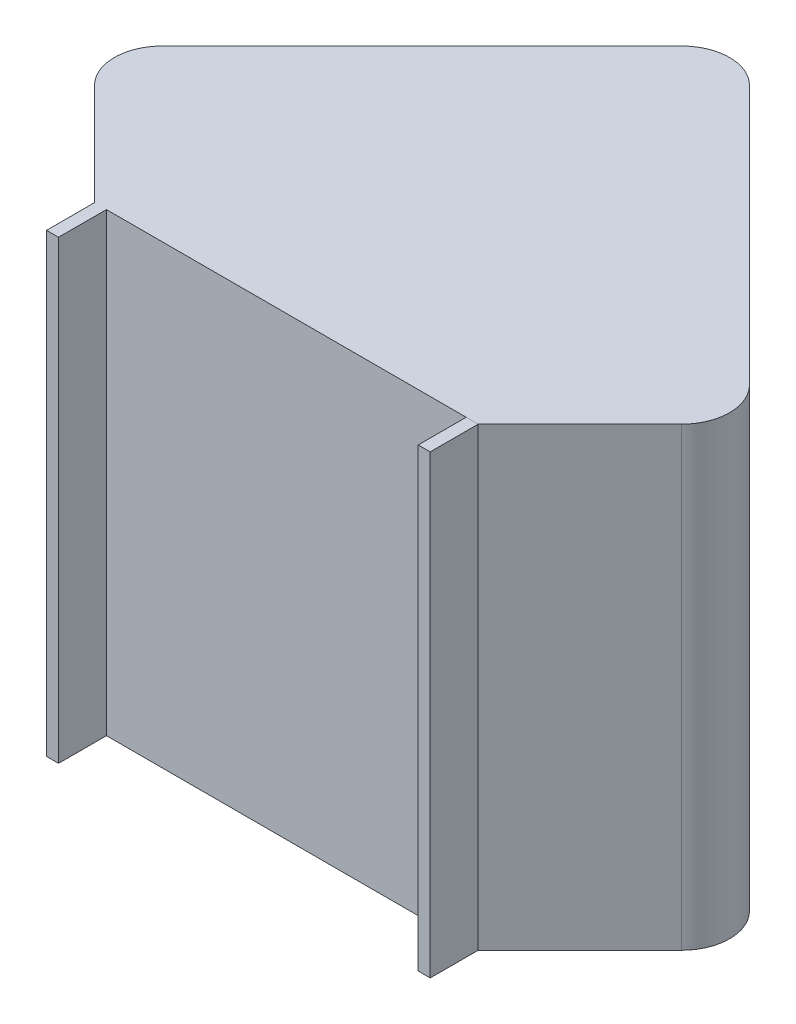
ISO-10303-21;
HEADER;
FILE_DESCRIPTION(('STEP AP214'),'2;1');
FILE_NAME('part.step','',(''),(''),'','','');
FILE_SCHEMA(('AUTOMOTIVE_DESIGN { 1 0 10303 214 1 1 1 1 }'));
ENDSEC;
DATA;
#1=APPLICATION_CONTEXT('core data for automotive mechanical design processes');
#2=APPLICATION_PROTOCOL_DEFINITION('international standard','automotive_design',2000,#1);
#3=PRODUCT_CONTEXT('',#1,'mechanical');
#4=PRODUCT('Part','Part','',(#3));
#5=PRODUCT_RELATED_PRODUCT_CATEGORY('part','',(#4));
#6=PRODUCT_DEFINITION_FORMATION('','',#4);
#7=PRODUCT_DEFINITION_CONTEXT('part definition',#1,'design');
#8=PRODUCT_DEFINITION('design','',#6,#7);
#9=PRODUCT_DEFINITION_SHAPE('','',#8);
#10=(LENGTH_UNIT() NAMED_UNIT(*) SI_UNIT(.MILLI.,.METRE.));
#11=(NAMED_UNIT(*) PLANE_ANGLE_UNIT() SI_UNIT($,.RADIAN.));
#12=(NAMED_UNIT(*) SI_UNIT($,.STERADIAN.) SOLID_ANGLE_UNIT());
#13=UNCERTAINTY_MEASURE_WITH_UNIT(LENGTH_MEASURE(1.E-05),#10,'distance_accuracy_value','');
#14=(GEOMETRIC_REPRESENTATION_CONTEXT(3) GLOBAL_UNCERTAINTY_ASSIGNED_CONTEXT((#13)) GLOBAL_UNIT_ASSIGNED_CONTEXT((#10,
#11,#12)) REPRESENTATION_CONTEXT('',''));
#15=CARTESIAN_POINT('',(0.,0.,0.));
#16=DIRECTION('',(0.,0.,1.));
#17=DIRECTION('',(1.,0.,0.));
#18=AXIS2_PLACEMENT_3D('',#15,#16,#17);
#19=CARTESIAN_POINT('',(0.,241.3,0.));
#20=DIRECTION('',(1.,0.,0.));
#21=DIRECTION('',(0.,0.,-1.));
#22=AXIS2_PLACEMENT_3D('',#19,#20,#21);
#23=PLANE('',#22);
#24=DIRECTION('',(0.,0.,1.));
#25=VECTOR('',#24,1.);
#26=CARTESIAN_POINT('',(0.,0.,0.));
#27=LINE('',#26,#25);
#28=CARTESIAN_POINT('',(0.,0.,0.));
#29=VERTEX_POINT('',#28);
#30=CARTESIAN_POINT('',(0.,0.,25.4));
#31=VERTEX_POINT('',#30);
#32=EDGE_CURVE('E107',#29,#31,#27,.T.);
#33=ORIENTED_EDGE('',*,*,#32,.F.);
#34=DIRECTION('',(0.,-1.,0.));
#35=VECTOR('',#34,1.);
#36=CARTESIAN_POINT('',(0.,241.3,0.));
#37=LINE('',#36,#35);
#38=CARTESIAN_POINT('',(0.,241.3,0.));
#39=VERTEX_POINT('',#38);
#40=EDGE_CURVE('E12',#39,#29,#37,.T.);
#41=ORIENTED_EDGE('',*,*,#40,.F.);
#42=DIRECTION('',(0.,0.,1.));
#43=VECTOR('',#42,1.);
#44=CARTESIAN_POINT('',(0.,241.3,0.));
#45=LINE('',#44,#43);
#46=CARTESIAN_POINT('',(0.,241.3,25.4));
#47=VERTEX_POINT('',#46);
#48=EDGE_CURVE('E101',#39,#47,#45,.T.);
#49=ORIENTED_EDGE('',*,*,#48,.T.);
#50=DIRECTION('',(0.,-1.,0.));
#51=VECTOR('',#50,1.);
#52=CARTESIAN_POINT('',(0.,241.3,25.4));
#53=LINE('',#52,#51);
#54=EDGE_CURVE('E46',#47,#31,#53,.T.);
#55=ORIENTED_EDGE('',*,*,#54,.T.);
#56=EDGE_LOOP('',(#33,#41,#49,#55));
#57=FACE_BOUND('',#56,.T.);
#58=ADVANCED_FACE('F43',(#57),#23,.T.);
#59=CARTESIAN_POINT('',(0.,241.3,0.));
#60=DIRECTION('',(0.,0.,-1.));
#61=DIRECTION('',(-1.,0.,0.));
#62=AXIS2_PLACEMENT_3D('',#59,#60,#61);
#63=PLANE('',#62);
#64=DIRECTION('',(1.,0.,0.));
#65=VECTOR('',#64,1.);
#66=CARTESIAN_POINT('',(0.,0.,0.));
#67=LINE('',#66,#65);
#68=CARTESIAN_POINT('',(-6.35,0.,0.));
#69=VERTEX_POINT('',#68);
#70=EDGE_CURVE('E103',#69,#29,#67,.T.);
#71=ORIENTED_EDGE('',*,*,#70,.F.);
#72=DIRECTION('',(0.,-1.,0.));
#73=VECTOR('',#72,1.);
#74=CARTESIAN_POINT('',(-6.35,241.3,0.));
#75=LINE('',#74,#73);
#76=CARTESIAN_POINT('',(-6.35,241.3,0.));
#77=VERTEX_POINT('',#76);
#78=EDGE_CURVE('E52',#77,#69,#75,.T.);
#79=ORIENTED_EDGE('',*,*,#78,.F.);
#80=DIRECTION('',(1.,0.,0.));
#81=VECTOR('',#80,1.);
#82=CARTESIAN_POINT('',(0.,241.3,0.));
#83=LINE('',#82,#81);
#84=EDGE_CURVE('E98',#77,#39,#83,.T.);
#85=ORIENTED_EDGE('',*,*,#84,.T.);
#86=ORIENTED_EDGE('',*,*,#40,.T.);
#87=EDGE_LOOP('',(#71,#79,#85,#86));
#88=FACE_BOUND('',#87,.T.);
#89=ADVANCED_FACE('F117',(#88),#63,.T.);
#90=CARTESIAN_POINT('',(-6.35,241.3,0.));
#91=DIRECTION('',(-1.,0.,0.));
#92=DIRECTION('',(0.,0.,1.));
#93=AXIS2_PLACEMENT_3D('',#90,#91,#92);
#94=PLANE('',#93);
#95=DIRECTION('',(0.,0.,-1.));
#96=VECTOR('',#95,1.);
#97=CARTESIAN_POINT('',(-6.35,0.,0.));
#98=LINE('',#97,#96);
#99=CARTESIAN_POINT('',(-6.35,0.,25.4));
#100=VERTEX_POINT('',#99);
#101=EDGE_CURVE('E93',#100,#69,#98,.T.);
#102=ORIENTED_EDGE('',*,*,#101,.F.);
#103=DIRECTION('',(0.,-1.,0.));
#104=VECTOR('',#103,1.);
#105=CARTESIAN_POINT('',(-6.35,241.3,25.4));
#106=LINE('',#105,#104);
#107=CARTESIAN_POINT('',(-6.35,241.3,25.4));
#108=VERTEX_POINT('',#107);
#109=EDGE_CURVE('E88',#108,#100,#106,.T.);
#110=ORIENTED_EDGE('',*,*,#109,.F.);
#111=DIRECTION('',(0.,0.,-1.));
#112=VECTOR('',#111,1.);
#113=CARTESIAN_POINT('',(-6.35,241.3,0.));
#114=LINE('',#113,#112);
#115=EDGE_CURVE('E91',#108,#77,#114,.T.);
#116=ORIENTED_EDGE('',*,*,#115,.T.);
#117=ORIENTED_EDGE('',*,*,#78,.T.);
#118=EDGE_LOOP('',(#102,#110,#116,#117));
#119=FACE_BOUND('',#118,.T.);
#120=ADVANCED_FACE('F90',(#119),#94,.T.);
#121=CARTESIAN_POINT('',(0.,241.3,25.4));
#122=DIRECTION('',(0.,0.,1.));
#123=DIRECTION('',(1.,0.,0.));
#124=AXIS2_PLACEMENT_3D('',#121,#122,#123);
#125=PLANE('',#124);
#126=DIRECTION('',(-1.,0.,0.));
#127=VECTOR('',#126,1.);
#128=CARTESIAN_POINT('',(0.,0.,25.4));
#129=LINE('',#128,#127);
#130=EDGE_CURVE('E110',#31,#100,#129,.T.);
#131=ORIENTED_EDGE('',*,*,#130,.F.);
#132=ORIENTED_EDGE('',*,*,#54,.F.);
#133=DIRECTION('',(-1.,0.,0.));
#134=VECTOR('',#133,1.);
#135=CARTESIAN_POINT('',(0.,241.3,25.4));
#136=LINE('',#135,#134);
#137=EDGE_CURVE('E97',#47,#108,#136,.T.);
#138=ORIENTED_EDGE('',*,*,#137,.T.);
#139=ORIENTED_EDGE('',*,*,#109,.T.);
#140=EDGE_LOOP('',(#131,#132,#138,#139));
#141=FACE_BOUND('',#140,.T.);
#142=ADVANCED_FACE('F100',(#141),#125,.T.);
#143=CARTESIAN_POINT('',(0.,241.3,0.));
#144=DIRECTION('',(0.,-1.,0.));
#145=DIRECTION('',(0.,0.,-1.));
#146=AXIS2_PLACEMENT_3D('',#143,#144,#145);
#147=PLANE('',#146);
#148=ORIENTED_EDGE('',*,*,#48,.F.);
#149=ORIENTED_EDGE('',*,*,#84,.F.);
#150=ORIENTED_EDGE('',*,*,#115,.F.);
#151=ORIENTED_EDGE('',*,*,#137,.F.);
#152=EDGE_LOOP('',(#148,#149,#150,#151));
#153=FACE_BOUND('',#152,.T.);
#154=ADVANCED_FACE('F96',(#153),#147,.F.);
#155=CARTESIAN_POINT('',(0.,0.,0.));
#156=DIRECTION('',(0.,-1.,0.));
#157=DIRECTION('',(0.,0.,-1.));
#158=AXIS2_PLACEMENT_3D('',#155,#156,#157);
#159=PLANE('',#158);
#160=ORIENTED_EDGE('',*,*,#32,.T.);
#161=ORIENTED_EDGE('',*,*,#130,.T.);
#162=ORIENTED_EDGE('',*,*,#101,.T.);
#163=ORIENTED_EDGE('',*,*,#70,.T.);
#164=EDGE_LOOP('',(#160,#161,#162,#163));
#165=FACE_BOUND('',#164,.T.);
#166=ADVANCED_FACE('F116',(#165),#159,.T.);
#167=CLOSED_SHELL('',(#58,#89,#120,#142,#154,#166));
#168=MANIFOLD_SOLID_BREP('B2',#167);
#169=CARTESIAN_POINT('',(-203.2,241.3,0.));
#170=DIRECTION('',(-1.,0.,0.));
#171=DIRECTION('',(0.,0.,1.));
#172=AXIS2_PLACEMENT_3D('',#169,#170,#171);
#173=PLANE('',#172);
#174=DIRECTION('',(0.,0.,-1.));
#175=VECTOR('',#174,1.);
#176=CARTESIAN_POINT('',(-203.2,0.,0.));
#177=LINE('',#176,#175);
#178=CARTESIAN_POINT('',(-203.2,0.,25.4));
#179=VERTEX_POINT('',#178);
#180=CARTESIAN_POINT('',(-203.2,0.,0.));
#181=VERTEX_POINT('',#180);
#182=EDGE_CURVE('E267',#179,#181,#177,.T.);
#183=ORIENTED_EDGE('',*,*,#182,.F.);
#184=DIRECTION('',(0.,-1.,0.));
#185=VECTOR('',#184,1.);
#186=CARTESIAN_POINT('',(-203.2,241.3,25.4));
#187=LINE('',#186,#185);
#188=CARTESIAN_POINT('',(-203.2,241.3,25.4));
#189=VERTEX_POINT('',#188);
#190=EDGE_CURVE('E304',#189,#179,#187,.T.);
#191=ORIENTED_EDGE('',*,*,#190,.F.);
#192=DIRECTION('',(0.,0.,-1.));
#193=VECTOR('',#192,1.);
#194=CARTESIAN_POINT('',(-203.2,241.3,0.));
#195=LINE('',#194,#193);
#196=CARTESIAN_POINT('',(-203.2,241.3,0.));
#197=VERTEX_POINT('',#196);
#198=EDGE_CURVE('E288',#189,#197,#195,.T.);
#199=ORIENTED_EDGE('',*,*,#198,.T.);
#200=DIRECTION('',(0.,-1.,0.));
#201=VECTOR('',#200,1.);
#202=CARTESIAN_POINT('',(-203.2,241.3,0.));
#203=LINE('',#202,#201);
#204=EDGE_CURVE('E296',#197,#181,#203,.T.);
#205=ORIENTED_EDGE('',*,*,#204,.T.);
#206=EDGE_LOOP('',(#183,#191,#199,#205));
#207=FACE_BOUND('',#206,.T.);
#208=ADVANCED_FACE('F167',(#207),#173,.T.);
#209=CARTESIAN_POINT('',(-203.2,241.3,25.4));
#210=DIRECTION('',(0.,0.,1.));
#211=DIRECTION('',(1.,0.,0.));
#212=AXIS2_PLACEMENT_3D('',#209,#210,#211);
#213=PLANE('',#212);
#214=DIRECTION('',(-1.,0.,0.));
#215=VECTOR('',#214,1.);
#216=CARTESIAN_POINT('',(-203.2,0.,25.4));
#217=LINE('',#216,#215);
#218=CARTESIAN_POINT('',(-196.85,0.,25.4));
#219=VERTEX_POINT('',#218);
#220=EDGE_CURVE('E291',#219,#179,#217,.T.);
#221=ORIENTED_EDGE('',*,*,#220,.F.);
#222=DIRECTION('',(0.,-1.,0.));
#223=VECTOR('',#222,1.);
#224=CARTESIAN_POINT('',(-196.85,241.3,25.4));
#225=LINE('',#224,#223);
#226=CARTESIAN_POINT('',(-196.85,241.3,25.4));
#227=VERTEX_POINT('',#226);
#228=EDGE_CURVE('E307',#227,#219,#225,.T.);
#229=ORIENTED_EDGE('',*,*,#228,.F.);
#230=DIRECTION('',(-1.,0.,0.));
#231=VECTOR('',#230,1.);
#232=CARTESIAN_POINT('',(-203.2,241.3,25.4));
#233=LINE('',#232,#231);
#234=EDGE_CURVE('E293',#227,#189,#233,.T.);
#235=ORIENTED_EDGE('',*,*,#234,.T.);
#236=ORIENTED_EDGE('',*,*,#190,.T.);
#237=EDGE_LOOP('',(#221,#229,#235,#236));
#238=FACE_BOUND('',#237,.T.);
#239=ADVANCED_FACE('F365',(#238),#213,.T.);
#240=CARTESIAN_POINT('',(-196.85,241.3,0.));
#241=DIRECTION('',(1.,0.,0.));
#242=DIRECTION('',(0.,0.,-1.));
#243=AXIS2_PLACEMENT_3D('',#240,#241,#242);
#244=PLANE('',#243);
#245=DIRECTION('',(0.,0.,1.));
#246=VECTOR('',#245,1.);
#247=CARTESIAN_POINT('',(-196.85,0.,0.));
#248=LINE('',#247,#246);
#249=CARTESIAN_POINT('',(-196.85,0.,0.));
#250=VERTEX_POINT('',#249);
#251=EDGE_CURVE('E299',#250,#219,#248,.T.);
#252=ORIENTED_EDGE('',*,*,#251,.F.);
#253=DIRECTION('',(0.,-1.,0.));
#254=VECTOR('',#253,1.);
#255=CARTESIAN_POINT('',(-196.85,241.3,0.));
#256=LINE('',#255,#254);
#257=CARTESIAN_POINT('',(-196.85,241.3,0.));
#258=VERTEX_POINT('',#257);
#259=EDGE_CURVE('E309',#258,#250,#256,.T.);
#260=ORIENTED_EDGE('',*,*,#259,.F.);
#261=DIRECTION('',(0.,0.,1.));
#262=VECTOR('',#261,1.);
#263=CARTESIAN_POINT('',(-196.85,241.3,0.));
#264=LINE('',#263,#262);
#265=EDGE_CURVE('E257',#258,#227,#264,.T.);
#266=ORIENTED_EDGE('',*,*,#265,.T.);
#267=ORIENTED_EDGE('',*,*,#228,.T.);
#268=EDGE_LOOP('',(#252,#260,#266,#267));
#269=FACE_BOUND('',#268,.T.);
#270=ADVANCED_FACE('F367',(#269),#244,.T.);
#271=CARTESIAN_POINT('',(0.,241.3,0.));
#272=DIRECTION('',(0.,1.,0.));
#273=DIRECTION('',(0.,0.,1.));
#274=AXIS2_PLACEMENT_3D('',#271,#272,#273);
#275=PLANE('',#274);
#276=DIRECTION('',(0.707106781186548,0.,-0.707106781186548));
#277=VECTOR('',#276,1.);
#278=CARTESIAN_POINT('',(71.8420489685532,241.3,-71.8420489685532));
#279=LINE('',#278,#277);
#280=CARTESIAN_POINT('',(0.,241.3,0.));
#281=VERTEX_POINT('',#280);
#282=CARTESIAN_POINT('',(53.8815367264149,241.3,-53.8815367264149));
#283=VERTEX_POINT('',#282);
#284=EDGE_CURVE('E253',#281,#283,#279,.T.);
#285=ORIENTED_EDGE('',*,*,#284,.T.);
#286=CARTESIAN_POINT('',(35.9210244842766,241.3,-71.8420489685532));
#287=DIRECTION('',(0.,1.,0.));
#288=DIRECTION('',(0.,0.,1.));
#289=AXIS2_PLACEMENT_3D('',#286,#287,#288);
#290=CIRCLE('',#289,25.4);
#291=CARTESIAN_POINT('',(53.8815367264149,241.3,-89.8025612106916));
#292=VERTEX_POINT('',#291);
#293=EDGE_CURVE('E41',#283,#292,#290,.T.);
#294=ORIENTED_EDGE('',*,*,#293,.T.);
#295=DIRECTION('',(-0.707106781186547,0.,-0.707106781186547));
#296=VECTOR('',#295,1.);
#297=CARTESIAN_POINT('',(-101.6,241.3,-245.284097937106));
#298=LINE('',#297,#296);
#299=CARTESIAN_POINT('',(-83.6394877578617,241.3,-227.323585694968));
#300=VERTEX_POINT('',#299);
#301=EDGE_CURVE('E270',#292,#300,#298,.T.);
#302=ORIENTED_EDGE('',*,*,#301,.T.);
#303=CARTESIAN_POINT('',(-101.6,241.3,-209.36307345283));
#304=DIRECTION('',(0.,1.,0.));
#305=DIRECTION('',(0.,0.,1.));
#306=AXIS2_PLACEMENT_3D('',#303,#304,#305);
#307=CIRCLE('',#306,25.4);
#308=CARTESIAN_POINT('',(-119.560512242138,241.3,-227.323585694968));
#309=VERTEX_POINT('',#308);
#310=EDGE_CURVE('E321',#300,#309,#307,.T.);
#311=ORIENTED_EDGE('',*,*,#310,.T.);
#312=DIRECTION('',(-0.707106781186548,0.,0.707106781186547));
#313=VECTOR('',#312,1.);
#314=CARTESIAN_POINT('',(-275.042048968553,241.3,-71.8420489685532));
#315=LINE('',#314,#313);
#316=CARTESIAN_POINT('',(-257.081536726415,241.3,-89.8025612106915));
#317=VERTEX_POINT('',#316);
#318=EDGE_CURVE('E272',#309,#317,#315,.T.);
#319=ORIENTED_EDGE('',*,*,#318,.T.);
#320=CARTESIAN_POINT('',(-239.121024484277,241.3,-71.8420489685532));
#321=DIRECTION('',(0.,1.,0.));
#322=DIRECTION('',(0.,0.,1.));
#323=AXIS2_PLACEMENT_3D('',#320,#321,#322);
#324=CIRCLE('',#323,25.4);
#325=CARTESIAN_POINT('',(-257.081536726415,241.3,-53.8815367264149));
#326=VERTEX_POINT('',#325);
#327=EDGE_CURVE('E330',#317,#326,#324,.T.);
#328=ORIENTED_EDGE('',*,*,#327,.T.);
#329=DIRECTION('',(0.707106781186548,0.,0.707106781186547));
#330=VECTOR('',#329,1.);
#331=CARTESIAN_POINT('',(-203.2,241.3,0.));
#332=LINE('',#331,#330);
#333=EDGE_CURVE('E261',#326,#197,#332,.T.);
#334=ORIENTED_EDGE('',*,*,#333,.T.);
#335=ORIENTED_EDGE('',*,*,#198,.F.);
#336=ORIENTED_EDGE('',*,*,#234,.F.);
#337=ORIENTED_EDGE('',*,*,#265,.F.);
#338=DIRECTION('',(1.,0.,0.));
#339=VECTOR('',#338,1.);
#340=CARTESIAN_POINT('',(0.,241.3,0.));
#341=LINE('',#340,#339);
#342=EDGE_CURVE('E250',#258,#281,#341,.T.);
#343=ORIENTED_EDGE('',*,*,#342,.T.);
#344=EDGE_LOOP('',(#285,#294,#302,#311,#319,#328,#334,#335,#336,#337,#343));
#345=FACE_BOUND('',#344,.T.);
#346=ADVANCED_FACE('F252',(#345),#275,.T.);
#347=CARTESIAN_POINT('',(0.,0.,0.));
#348=DIRECTION('',(0.,1.,0.));
#349=DIRECTION('',(0.,0.,1.));
#350=AXIS2_PLACEMENT_3D('',#347,#348,#349);
#351=PLANE('',#350);
#352=DIRECTION('',(-0.707106781186547,0.,-0.707106781186547));
#353=VECTOR('',#352,1.);
#354=CARTESIAN_POINT('',(-101.6,0.,-245.284097937106));
#355=LINE('',#354,#353);
#356=CARTESIAN_POINT('',(53.8815367264149,0.,-89.8025612106916));
#357=VERTEX_POINT('',#356);
#358=CARTESIAN_POINT('',(-83.6394877578617,0.,-227.323585694968));
#359=VERTEX_POINT('',#358);
#360=EDGE_CURVE('E282',#357,#359,#355,.T.);
#361=ORIENTED_EDGE('',*,*,#360,.F.);
#362=CARTESIAN_POINT('',(35.9210244842766,0.,-71.8420489685532));
#363=DIRECTION('',(0.,1.,0.));
#364=DIRECTION('',(0.,0.,1.));
#365=AXIS2_PLACEMENT_3D('',#362,#363,#364);
#366=CIRCLE('',#365,25.4);
#367=CARTESIAN_POINT('',(53.8815367264149,0.,-53.8815367264149));
#368=VERTEX_POINT('',#367);
#369=EDGE_CURVE('E189',#357,#368,#366,.F.);
#370=ORIENTED_EDGE('',*,*,#369,.T.);
#371=DIRECTION('',(0.707106781186548,0.,-0.707106781186548));
#372=VECTOR('',#371,1.);
#373=CARTESIAN_POINT('',(71.8420489685532,0.,-71.8420489685532));
#374=LINE('',#373,#372);
#375=CARTESIAN_POINT('',(0.,0.,0.));
#376=VERTEX_POINT('',#375);
#377=EDGE_CURVE('E280',#376,#368,#374,.T.);
#378=ORIENTED_EDGE('',*,*,#377,.F.);
#379=DIRECTION('',(1.,0.,0.));
#380=VECTOR('',#379,1.);
#381=CARTESIAN_POINT('',(0.,0.,0.));
#382=LINE('',#381,#380);
#383=EDGE_CURVE('E266',#250,#376,#382,.T.);
#384=ORIENTED_EDGE('',*,*,#383,.F.);
#385=ORIENTED_EDGE('',*,*,#251,.T.);
#386=ORIENTED_EDGE('',*,*,#220,.T.);
#387=ORIENTED_EDGE('',*,*,#182,.T.);
#388=DIRECTION('',(0.707106781186548,0.,0.707106781186547));
#389=VECTOR('',#388,1.);
#390=CARTESIAN_POINT('',(-203.2,0.,0.));
#391=LINE('',#390,#389);
#392=CARTESIAN_POINT('',(-257.081536726415,0.,-53.8815367264149));
#393=VERTEX_POINT('',#392);
#394=EDGE_CURVE('E274',#393,#181,#391,.T.);
#395=ORIENTED_EDGE('',*,*,#394,.F.);
#396=CARTESIAN_POINT('',(-239.121024484277,0.,-71.8420489685532));
#397=DIRECTION('',(0.,1.,0.));
#398=DIRECTION('',(0.,0.,1.));
#399=AXIS2_PLACEMENT_3D('',#396,#397,#398);
#400=CIRCLE('',#399,25.4);
#401=CARTESIAN_POINT('',(-257.081536726415,0.,-89.8025612106915));
#402=VERTEX_POINT('',#401);
#403=EDGE_CURVE('E326',#393,#402,#400,.F.);
#404=ORIENTED_EDGE('',*,*,#403,.T.);
#405=DIRECTION('',(-0.707106781186548,0.,0.707106781186547));
#406=VECTOR('',#405,1.);
#407=CARTESIAN_POINT('',(-275.042048968553,0.,-71.8420489685532));
#408=LINE('',#407,#406);
#409=CARTESIAN_POINT('',(-119.560512242138,0.,-227.323585694968));
#410=VERTEX_POINT('',#409);
#411=EDGE_CURVE('E284',#410,#402,#408,.T.);
#412=ORIENTED_EDGE('',*,*,#411,.F.);
#413=CARTESIAN_POINT('',(-101.6,0.,-209.36307345283));
#414=DIRECTION('',(0.,1.,0.));
#415=DIRECTION('',(0.,0.,1.));
#416=AXIS2_PLACEMENT_3D('',#413,#414,#415);
#417=CIRCLE('',#416,25.4);
#418=EDGE_CURVE('E315',#410,#359,#417,.F.);
#419=ORIENTED_EDGE('',*,*,#418,.T.);
#420=EDGE_LOOP('',(#361,#370,#378,#384,#385,#386,#387,#395,#404,#412,#419));
#421=FACE_BOUND('',#420,.T.);
#422=ADVANCED_FACE('F340',(#421),#351,.F.);
#423=CARTESIAN_POINT('',(0.,241.3,0.));
#424=DIRECTION('',(0.,0.,-1.));
#425=DIRECTION('',(-1.,0.,0.));
#426=AXIS2_PLACEMENT_3D('',#423,#424,#425);
#427=PLANE('',#426);
#428=ORIENTED_EDGE('',*,*,#342,.F.);
#429=ORIENTED_EDGE('',*,*,#259,.T.);
#430=ORIENTED_EDGE('',*,*,#383,.T.);
#431=DIRECTION('',(0.,-1.,0.));
#432=VECTOR('',#431,1.);
#433=CARTESIAN_POINT('',(0.,241.3,0.));
#434=LINE('',#433,#432);
#435=EDGE_CURVE('E260',#281,#376,#434,.T.);
#436=ORIENTED_EDGE('',*,*,#435,.F.);
#437=EDGE_LOOP('',(#428,#429,#430,#436));
#438=FACE_BOUND('',#437,.T.);
#439=ADVANCED_FACE('F264',(#438),#427,.F.);
#440=CARTESIAN_POINT('',(71.8420489685532,241.3,-71.8420489685532));
#441=DIRECTION('',(-0.707106781186548,0.,-0.707106781186548));
#442=DIRECTION('',(-0.707106781186548,0.,0.707106781186548));
#443=AXIS2_PLACEMENT_3D('',#440,#441,#442);
#444=PLANE('',#443);
#445=ORIENTED_EDGE('',*,*,#377,.T.);
#446=DIRECTION('',(0.,-1.,0.));
#447=VECTOR('',#446,1.);
#448=CARTESIAN_POINT('',(53.8815367264149,241.3,-53.8815367264149));
#449=LINE('',#448,#447);
#450=EDGE_CURVE('E175',#368,#283,#449,.F.);
#451=ORIENTED_EDGE('',*,*,#450,.T.);
#452=ORIENTED_EDGE('',*,*,#284,.F.);
#453=ORIENTED_EDGE('',*,*,#435,.T.);
#454=EDGE_LOOP('',(#445,#451,#452,#453));
#455=FACE_BOUND('',#454,.T.);
#456=ADVANCED_FACE('F269',(#455),#444,.F.);
#457=CARTESIAN_POINT('',(-101.6,241.3,-245.284097937106));
#458=DIRECTION('',(-0.707106781186547,0.,0.707106781186547));
#459=DIRECTION('',(0.707106781186548,0.,0.707106781186548));
#460=AXIS2_PLACEMENT_3D('',#457,#458,#459);
#461=PLANE('',#460);
#462=ORIENTED_EDGE('',*,*,#301,.F.);
#463=DIRECTION('',(0.,-1.,0.));
#464=VECTOR('',#463,1.);
#465=CARTESIAN_POINT('',(53.8815367264149,241.3,-89.8025612106915));
#466=LINE('',#465,#464);
#467=EDGE_CURVE('E332',#292,#357,#466,.T.);
#468=ORIENTED_EDGE('',*,*,#467,.T.);
#469=ORIENTED_EDGE('',*,*,#360,.T.);
#470=DIRECTION('',(0.,-1.,0.));
#471=VECTOR('',#470,1.);
#472=CARTESIAN_POINT('',(-83.6394877578617,241.3,-227.323585694968));
#473=LINE('',#472,#471);
#474=EDGE_CURVE('E318',#359,#300,#473,.F.);
#475=ORIENTED_EDGE('',*,*,#474,.T.);
#476=EDGE_LOOP('',(#462,#468,#469,#475));
#477=FACE_BOUND('',#476,.T.);
#478=ADVANCED_FACE('F338',(#477),#461,.F.);
#479=CARTESIAN_POINT('',(-275.042048968553,241.3,-71.8420489685532));
#480=DIRECTION('',(0.707106781186547,0.,0.707106781186548));
#481=DIRECTION('',(0.707106781186548,0.,-0.707106781186547));
#482=AXIS2_PLACEMENT_3D('',#479,#480,#481);
#483=PLANE('',#482);
#484=ORIENTED_EDGE('',*,*,#411,.T.);
#485=DIRECTION('',(0.,-1.,0.));
#486=VECTOR('',#485,1.);
#487=CARTESIAN_POINT('',(-257.081536726415,241.3,-89.8025612106915));
#488=LINE('',#487,#486);
#489=EDGE_CURVE('E328',#402,#317,#488,.F.);
#490=ORIENTED_EDGE('',*,*,#489,.T.);
#491=ORIENTED_EDGE('',*,*,#318,.F.);
#492=DIRECTION('',(0.,-1.,0.));
#493=VECTOR('',#492,1.);
#494=CARTESIAN_POINT('',(-119.560512242138,241.3,-227.323585694968));
#495=LINE('',#494,#493);
#496=EDGE_CURVE('E306',#309,#410,#495,.T.);
#497=ORIENTED_EDGE('',*,*,#496,.T.);
#498=EDGE_LOOP('',(#484,#490,#491,#497));
#499=FACE_BOUND('',#498,.T.);
#500=ADVANCED_FACE('F350',(#499),#483,.F.);
#501=CARTESIAN_POINT('',(-203.2,241.3,0.));
#502=DIRECTION('',(0.707106781186547,0.,-0.707106781186548));
#503=DIRECTION('',(-0.707106781186548,0.,-0.707106781186547));
#504=AXIS2_PLACEMENT_3D('',#501,#502,#503);
#505=PLANE('',#504);
#506=ORIENTED_EDGE('',*,*,#333,.F.);
#507=DIRECTION('',(0.,-1.,0.));
#508=VECTOR('',#507,1.);
#509=CARTESIAN_POINT('',(-257.081536726415,241.3,-53.8815367264149));
#510=LINE('',#509,#508);
#511=EDGE_CURVE('E323',#326,#393,#510,.T.);
#512=ORIENTED_EDGE('',*,*,#511,.T.);
#513=ORIENTED_EDGE('',*,*,#394,.T.);
#514=ORIENTED_EDGE('',*,*,#204,.F.);
#515=EDGE_LOOP('',(#506,#512,#513,#514));
#516=FACE_BOUND('',#515,.T.);
#517=ADVANCED_FACE('F359',(#516),#505,.F.);
#518=CARTESIAN_POINT('',(-101.6,241.3,-209.36307345283));
#519=DIRECTION('',(0.,-1.,0.));
#520=DIRECTION('',(0.,0.,-1.));
#521=AXIS2_PLACEMENT_3D('',#518,#519,#520);
#522=CYLINDRICAL_SURFACE('',#521,25.4);
#523=ORIENTED_EDGE('',*,*,#310,.F.);
#524=ORIENTED_EDGE('',*,*,#474,.F.);
#525=ORIENTED_EDGE('',*,*,#418,.F.);
#526=ORIENTED_EDGE('',*,*,#496,.F.);
#527=EDGE_LOOP('',(#523,#524,#525,#526));
#528=FACE_BOUND('',#527,.T.);
#529=ADVANCED_FACE('F346',(#528),#522,.T.);
#530=CARTESIAN_POINT('',(-239.121024484277,241.3,-71.8420489685532));
#531=DIRECTION('',(0.,-1.,0.));
#532=DIRECTION('',(0.,0.,-1.));
#533=AXIS2_PLACEMENT_3D('',#530,#531,#532);
#534=CYLINDRICAL_SURFACE('',#533,25.4);
#535=ORIENTED_EDGE('',*,*,#327,.F.);
#536=ORIENTED_EDGE('',*,*,#489,.F.);
#537=ORIENTED_EDGE('',*,*,#403,.F.);
#538=ORIENTED_EDGE('',*,*,#511,.F.);
#539=EDGE_LOOP('',(#535,#536,#537,#538));
#540=FACE_BOUND('',#539,.T.);
#541=ADVANCED_FACE('F353',(#540),#534,.T.);
#542=CARTESIAN_POINT('',(35.9210244842766,241.3,-71.8420489685532));
#543=DIRECTION('',(0.,-1.,0.));
#544=DIRECTION('',(0.,0.,-1.));
#545=AXIS2_PLACEMENT_3D('',#542,#543,#544);
#546=CYLINDRICAL_SURFACE('',#545,25.4);
#547=ORIENTED_EDGE('',*,*,#293,.F.);
#548=ORIENTED_EDGE('',*,*,#450,.F.);
#549=ORIENTED_EDGE('',*,*,#369,.F.);
#550=ORIENTED_EDGE('',*,*,#467,.F.);
#551=EDGE_LOOP('',(#547,#548,#549,#550));
#552=FACE_BOUND('',#551,.T.);
#553=ADVANCED_FACE('F169',(#552),#546,.T.);
#554=CLOSED_SHELL('',(#208,#239,#270,#346,#422,#439,#456,#478,#500,#517,#529,#541,#553));
#555=MANIFOLD_SOLID_BREP('B6',#554);
#556=ADVANCED_BREP_SHAPE_REPRESENTATION('',(#18,#168,#555),#14);
#557=SHAPE_DEFINITION_REPRESENTATION(#9,#556);
ENDSEC;
END-ISO-10303-21;
